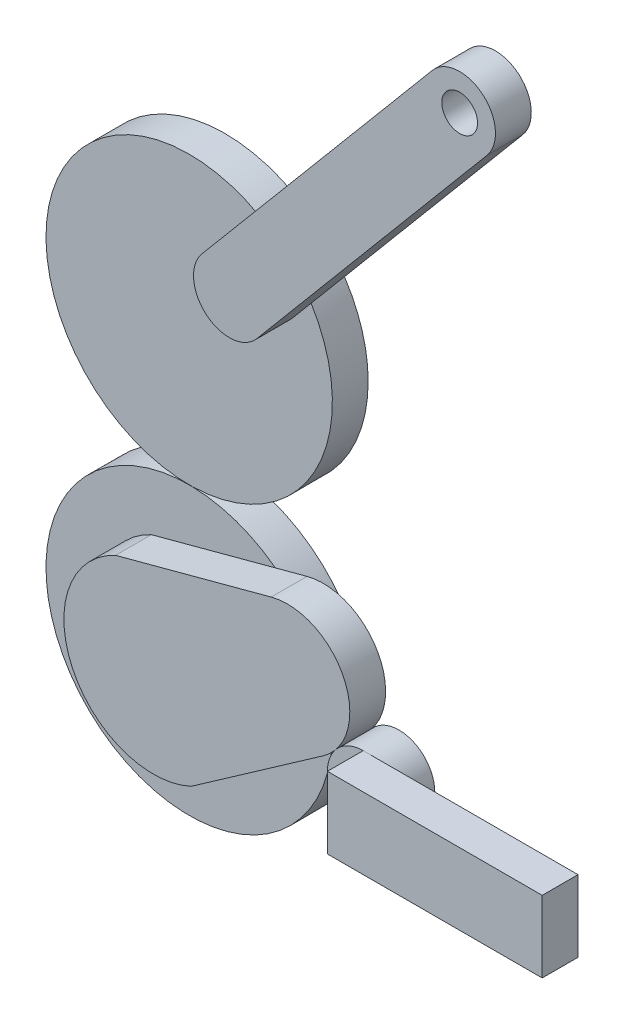
ISO-10303-21;
HEADER;
FILE_DESCRIPTION(('STEP AP214'),'2;1');
FILE_NAME('part.step','',(''),(''),'','','');
FILE_SCHEMA(('AUTOMOTIVE_DESIGN { 1 0 10303 214 1 1 1 1 }'));
ENDSEC;
DATA;
#1=APPLICATION_CONTEXT('core data for automotive mechanical design processes');
#2=APPLICATION_PROTOCOL_DEFINITION('international standard','automotive_design',2000,#1);
#3=PRODUCT_CONTEXT('',#1,'mechanical');
#4=PRODUCT('Part','Part','',(#3));
#5=PRODUCT_RELATED_PRODUCT_CATEGORY('part','',(#4));
#6=PRODUCT_DEFINITION_FORMATION('','',#4);
#7=PRODUCT_DEFINITION_CONTEXT('part definition',#1,'design');
#8=PRODUCT_DEFINITION('design','',#6,#7);
#9=PRODUCT_DEFINITION_SHAPE('','',#8);
#10=(LENGTH_UNIT() NAMED_UNIT(*) SI_UNIT(.MILLI.,.METRE.));
#11=(NAMED_UNIT(*) PLANE_ANGLE_UNIT() SI_UNIT($,.RADIAN.));
#12=(NAMED_UNIT(*) SI_UNIT($,.STERADIAN.) SOLID_ANGLE_UNIT());
#13=UNCERTAINTY_MEASURE_WITH_UNIT(LENGTH_MEASURE(1.E-05),#10,'distance_accuracy_value','');
#14=(GEOMETRIC_REPRESENTATION_CONTEXT(3) GLOBAL_UNCERTAINTY_ASSIGNED_CONTEXT((#13)) GLOBAL_UNIT_ASSIGNED_CONTEXT((#10,
#11,#12)) REPRESENTATION_CONTEXT('',''));
#15=CARTESIAN_POINT('',(0.,0.,0.));
#16=DIRECTION('',(0.,0.,1.));
#17=DIRECTION('',(1.,0.,0.));
#18=AXIS2_PLACEMENT_3D('',#15,#16,#17);
#19=CARTESIAN_POINT('',(58.6101560783245,-80.,20.));
#20=DIRECTION('',(0.,0.,-1.));
#21=DIRECTION('',(-1.,0.,0.));
#22=AXIS2_PLACEMENT_3D('',#19,#20,#21);
#23=CYLINDRICAL_SURFACE('',#22,10.);
#24=CARTESIAN_POINT('',(58.6101560783245,-80.,20.));
#25=DIRECTION('',(0.,0.,1.));
#26=DIRECTION('',(1.,0.,0.));
#27=AXIS2_PLACEMENT_3D('',#24,#25,#26);
#28=CIRCLE('',#27,10.);
#29=CARTESIAN_POINT('',(58.6101560783245,-70.,20.));
#30=VERTEX_POINT('',#29);
#31=CARTESIAN_POINT('',(58.6101560783245,-90.,20.));
#32=VERTEX_POINT('',#31);
#33=EDGE_CURVE('E12',#30,#32,#28,.T.);
#34=ORIENTED_EDGE('',*,*,#33,.F.);
#35=EDGE_CURVE('E58',#32,#30,#28,.T.);
#36=ORIENTED_EDGE('',*,*,#35,.F.);
#37=EDGE_LOOP('',(#34,#36));
#38=FACE_BOUND('',#37,.T.);
#39=CARTESIAN_POINT('',(58.6101560783245,-80.,10.));
#40=DIRECTION('',(0.,0.,1.));
#41=DIRECTION('',(1.,0.,0.));
#42=AXIS2_PLACEMENT_3D('',#39,#40,#41);
#43=CIRCLE('',#42,10.);
#44=CARTESIAN_POINT('',(68.6101560783245,-80.,10.));
#45=VERTEX_POINT('',#44);
#46=EDGE_CURVE('E53',#45,#45,#43,.T.);
#47=ORIENTED_EDGE('',*,*,#46,.T.);
#48=EDGE_LOOP('',(#47));
#49=FACE_BOUND('',#48,.T.);
#50=ADVANCED_FACE('F50',(#38,#49),#23,.T.);
#51=CARTESIAN_POINT('',(58.6101560783245,-80.,20.));
#52=DIRECTION('',(0.,0.,1.));
#53=DIRECTION('',(1.,0.,0.));
#54=AXIS2_PLACEMENT_3D('',#51,#52,#53);
#55=PLANE('',#54);
#56=DIRECTION('',(0.,-1.,0.));
#57=VECTOR('',#56,1.);
#58=CARTESIAN_POINT('',(58.6101560783245,-70.,20.));
#59=LINE('',#58,#57);
#60=EDGE_CURVE('E63',#30,#32,#59,.T.);
#61=ORIENTED_EDGE('',*,*,#60,.F.);
#62=ORIENTED_EDGE('',*,*,#33,.T.);
#63=EDGE_LOOP('',(#61,#62));
#64=FACE_BOUND('',#63,.T.);
#65=ADVANCED_FACE('F137',(#64),#55,.T.);
#66=CARTESIAN_POINT('',(58.6101560783245,-80.,10.));
#67=DIRECTION('',(0.,0.,1.));
#68=DIRECTION('',(1.,0.,0.));
#69=AXIS2_PLACEMENT_3D('',#66,#67,#68);
#70=PLANE('',#69);
#71=ORIENTED_EDGE('',*,*,#46,.F.);
#72=EDGE_LOOP('',(#71));
#73=FACE_BOUND('',#72,.T.);
#74=ADVANCED_FACE('F139',(#73),#70,.F.);
#75=CARTESIAN_POINT('',(0.,0.,20.));
#76=DIRECTION('',(0.,0.,1.));
#77=DIRECTION('',(1.,0.,0.));
#78=AXIS2_PLACEMENT_3D('',#75,#76,#77);
#79=PLANE('',#78);
#80=DIRECTION('',(1.,0.,0.));
#81=VECTOR('',#80,1.);
#82=CARTESIAN_POINT('',(58.6101560783245,-90.,20.));
#83=LINE('',#82,#81);
#84=CARTESIAN_POINT('',(118.610156078325,-90.,20.));
#85=VERTEX_POINT('',#84);
#86=EDGE_CURVE('E123',#32,#85,#83,.T.);
#87=ORIENTED_EDGE('',*,*,#86,.F.);
#88=ORIENTED_EDGE('',*,*,#35,.T.);
#89=DIRECTION('',(-1.,0.,0.));
#90=VECTOR('',#89,1.);
#91=CARTESIAN_POINT('',(118.610156078325,-70.,20.));
#92=LINE('',#91,#90);
#93=CARTESIAN_POINT('',(118.610156078325,-70.,20.));
#94=VERTEX_POINT('',#93);
#95=EDGE_CURVE('E119',#94,#30,#92,.T.);
#96=ORIENTED_EDGE('',*,*,#95,.F.);
#97=DIRECTION('',(0.,1.,0.));
#98=VECTOR('',#97,1.);
#99=CARTESIAN_POINT('',(118.610156078325,-90.,20.));
#100=LINE('',#99,#98);
#101=EDGE_CURVE('E88',#85,#94,#100,.T.);
#102=ORIENTED_EDGE('',*,*,#101,.F.);
#103=EDGE_LOOP('',(#87,#88,#96,#102));
#104=FACE_BOUND('',#103,.T.);
#105=ADVANCED_FACE('F135',(#104),#79,.F.);
#106=CARTESIAN_POINT('',(118.610156078325,-70.,30.));
#107=DIRECTION('',(0.,-1.,0.));
#108=DIRECTION('',(1.,0.,0.));
#109=AXIS2_PLACEMENT_3D('',#106,#107,#108);
#110=PLANE('',#109);
#111=ORIENTED_EDGE('',*,*,#95,.T.);
#112=DIRECTION('',(0.,0.,-1.));
#113=VECTOR('',#112,1.);
#114=CARTESIAN_POINT('',(58.6101560783245,-70.,30.));
#115=LINE('',#114,#113);
#116=CARTESIAN_POINT('',(58.6101560783245,-70.,30.));
#117=VERTEX_POINT('',#116);
#118=EDGE_CURVE('E110',#117,#30,#115,.T.);
#119=ORIENTED_EDGE('',*,*,#118,.F.);
#120=DIRECTION('',(-1.,0.,0.));
#121=VECTOR('',#120,1.);
#122=CARTESIAN_POINT('',(118.610156078325,-70.,30.));
#123=LINE('',#122,#121);
#124=CARTESIAN_POINT('',(118.610156078325,-70.,30.));
#125=VERTEX_POINT('',#124);
#126=EDGE_CURVE('E102',#125,#117,#123,.T.);
#127=ORIENTED_EDGE('',*,*,#126,.F.);
#128=DIRECTION('',(0.,0.,-1.));
#129=VECTOR('',#128,1.);
#130=CARTESIAN_POINT('',(118.610156078325,-70.,30.));
#131=LINE('',#130,#129);
#132=EDGE_CURVE('E115',#125,#94,#131,.T.);
#133=ORIENTED_EDGE('',*,*,#132,.T.);
#134=EDGE_LOOP('',(#111,#119,#127,#133));
#135=FACE_BOUND('',#134,.T.);
#136=ADVANCED_FACE('F147',(#135),#110,.F.);
#137=CARTESIAN_POINT('',(58.6101560783245,-70.,30.));
#138=DIRECTION('',(1.,0.,0.));
#139=DIRECTION('',(0.,0.,-1.));
#140=AXIS2_PLACEMENT_3D('',#137,#138,#139);
#141=PLANE('',#140);
#142=ORIENTED_EDGE('',*,*,#60,.T.);
#143=DIRECTION('',(0.,0.,-1.));
#144=VECTOR('',#143,1.);
#145=CARTESIAN_POINT('',(58.6101560783245,-90.,30.));
#146=LINE('',#145,#144);
#147=CARTESIAN_POINT('',(58.6101560783245,-90.,30.));
#148=VERTEX_POINT('',#147);
#149=EDGE_CURVE('E106',#148,#32,#146,.T.);
#150=ORIENTED_EDGE('',*,*,#149,.F.);
#151=DIRECTION('',(0.,-1.,0.));
#152=VECTOR('',#151,1.);
#153=CARTESIAN_POINT('',(58.6101560783245,-70.,30.));
#154=LINE('',#153,#152);
#155=EDGE_CURVE('E96',#117,#148,#154,.T.);
#156=ORIENTED_EDGE('',*,*,#155,.F.);
#157=ORIENTED_EDGE('',*,*,#118,.T.);
#158=EDGE_LOOP('',(#142,#150,#156,#157));
#159=FACE_BOUND('',#158,.T.);
#160=ADVANCED_FACE('F107',(#159),#141,.F.);
#161=CARTESIAN_POINT('',(58.6101560783245,-90.,30.));
#162=DIRECTION('',(0.,1.,0.));
#163=DIRECTION('',(0.,0.,1.));
#164=AXIS2_PLACEMENT_3D('',#161,#162,#163);
#165=PLANE('',#164);
#166=ORIENTED_EDGE('',*,*,#86,.T.);
#167=DIRECTION('',(0.,0.,-1.));
#168=VECTOR('',#167,1.);
#169=CARTESIAN_POINT('',(118.610156078325,-90.,30.));
#170=LINE('',#169,#168);
#171=CARTESIAN_POINT('',(118.610156078325,-90.,30.));
#172=VERTEX_POINT('',#171);
#173=EDGE_CURVE('E111',#172,#85,#170,.T.);
#174=ORIENTED_EDGE('',*,*,#173,.F.);
#175=DIRECTION('',(1.,0.,0.));
#176=VECTOR('',#175,1.);
#177=CARTESIAN_POINT('',(58.6101560783245,-90.,30.));
#178=LINE('',#177,#176);
#179=EDGE_CURVE('E99',#148,#172,#178,.T.);
#180=ORIENTED_EDGE('',*,*,#179,.F.);
#181=ORIENTED_EDGE('',*,*,#149,.T.);
#182=EDGE_LOOP('',(#166,#174,#180,#181));
#183=FACE_BOUND('',#182,.T.);
#184=ADVANCED_FACE('F113',(#183),#165,.F.);
#185=CARTESIAN_POINT('',(118.610156078325,-90.,30.));
#186=DIRECTION('',(-1.,0.,0.));
#187=DIRECTION('',(0.,0.,1.));
#188=AXIS2_PLACEMENT_3D('',#185,#186,#187);
#189=PLANE('',#188);
#190=ORIENTED_EDGE('',*,*,#101,.T.);
#191=ORIENTED_EDGE('',*,*,#132,.F.);
#192=DIRECTION('',(0.,1.,0.));
#193=VECTOR('',#192,1.);
#194=CARTESIAN_POINT('',(118.610156078325,-90.,30.));
#195=LINE('',#194,#193);
#196=EDGE_CURVE('E72',#172,#125,#195,.T.);
#197=ORIENTED_EDGE('',*,*,#196,.F.);
#198=ORIENTED_EDGE('',*,*,#173,.T.);
#199=EDGE_LOOP('',(#190,#191,#197,#198));
#200=FACE_BOUND('',#199,.T.);
#201=ADVANCED_FACE('F155',(#200),#189,.F.);
#202=CARTESIAN_POINT('',(0.,0.,30.));
#203=DIRECTION('',(0.,0.,1.));
#204=DIRECTION('',(1.,0.,0.));
#205=AXIS2_PLACEMENT_3D('',#202,#203,#204);
#206=PLANE('',#205);
#207=ORIENTED_EDGE('',*,*,#126,.T.);
#208=ORIENTED_EDGE('',*,*,#155,.T.);
#209=ORIENTED_EDGE('',*,*,#179,.T.);
#210=ORIENTED_EDGE('',*,*,#196,.T.);
#211=EDGE_LOOP('',(#207,#208,#209,#210));
#212=FACE_BOUND('',#211,.T.);
#213=ADVANCED_FACE('F97',(#212),#206,.T.);
#214=CLOSED_SHELL('',(#50,#65,#74,#105,#136,#160,#184,#201,#213));
#215=MANIFOLD_SOLID_BREP('B2',#214);
#216=CARTESIAN_POINT('',(0.,-80.,10.));
#217=DIRECTION('',(0.,0.,-1.));
#218=DIRECTION('',(-1.,0.,0.));
#219=AXIS2_PLACEMENT_3D('',#216,#217,#218);
#220=CYLINDRICAL_SURFACE('',#219,40.);
#221=CARTESIAN_POINT('',(0.,-80.,10.));
#222=DIRECTION('',(0.,0.,1.));
#223=DIRECTION('',(1.,0.,0.));
#224=AXIS2_PLACEMENT_3D('',#221,#222,#223);
#225=CIRCLE('',#224,40.);
#226=CARTESIAN_POINT('',(24.0789496189808,-48.0593646705864,10.));
#227=VERTEX_POINT('',#226);
#228=CARTESIAN_POINT('',(39.9455966731343,-82.0854990835007,10.));
#229=VERTEX_POINT('',#228);
#230=EDGE_CURVE('E234',#227,#229,#225,.T.);
#231=ORIENTED_EDGE('',*,*,#230,.F.);
#232=EDGE_CURVE('E300',#229,#227,#225,.T.);
#233=ORIENTED_EDGE('',*,*,#232,.F.);
#234=EDGE_LOOP('',(#231,#233));
#235=FACE_BOUND('',#234,.T.);
#236=CARTESIAN_POINT('',(0.,-80.,0.));
#237=DIRECTION('',(0.,0.,1.));
#238=DIRECTION('',(1.,0.,0.));
#239=AXIS2_PLACEMENT_3D('',#236,#237,#238);
#240=CIRCLE('',#239,40.);
#241=CARTESIAN_POINT('',(40.,-80.,0.));
#242=VERTEX_POINT('',#241);
#243=EDGE_CURVE('E228',#242,#242,#240,.T.);
#244=ORIENTED_EDGE('',*,*,#243,.T.);
#245=EDGE_LOOP('',(#244));
#246=FACE_BOUND('',#245,.T.);
#247=ADVANCED_FACE('F225',(#235,#246),#220,.T.);
#248=CARTESIAN_POINT('',(0.,-80.,10.));
#249=DIRECTION('',(0.,0.,1.));
#250=DIRECTION('',(1.,0.,0.));
#251=AXIS2_PLACEMENT_3D('',#248,#249,#250);
#252=PLANE('',#251);
#253=DIRECTION('',(-0.965925826289067,-0.258819045102525,0.));
#254=VECTOR('',#253,1.);
#255=CARTESIAN_POINT('',(-10.5654565435175,-57.3423053240838,10.));
#256=LINE('',#255,#254);
#257=CARTESIAN_POINT('',(-10.5654565435175,-57.3423053240838,10.));
#258=VERTEX_POINT('',#257);
#259=EDGE_CURVE('E48',#227,#258,#256,.T.);
#260=ORIENTED_EDGE('',*,*,#259,.F.);
#261=ORIENTED_EDGE('',*,*,#230,.T.);
#262=DIRECTION('',(0.819152044288988,0.573576436351051,0.));
#263=VECTOR('',#262,1.);
#264=CARTESIAN_POINT('',(10.5654565435175,-102.657694675916,10.));
#265=LINE('',#264,#263);
#266=CARTESIAN_POINT('',(10.5654565435175,-102.657694675916,10.));
#267=VERTEX_POINT('',#266);
#268=EDGE_CURVE('E247',#267,#229,#265,.T.);
#269=ORIENTED_EDGE('',*,*,#268,.F.);
#270=CARTESIAN_POINT('',(0.,-80.,10.));
#271=DIRECTION('',(0.,0.,1.));
#272=DIRECTION('',(-1.,0.,0.));
#273=AXIS2_PLACEMENT_3D('',#270,#271,#272);
#274=CIRCLE('',#273,25.);
#275=EDGE_CURVE('E243',#258,#267,#274,.T.);
#276=ORIENTED_EDGE('',*,*,#275,.F.);
#277=EDGE_LOOP('',(#260,#261,#269,#276));
#278=FACE_BOUND('',#277,.T.);
#279=ADVANCED_FACE('F349',(#278),#252,.T.);
#280=CARTESIAN_POINT('',(0.,-80.,0.));
#281=DIRECTION('',(0.,0.,1.));
#282=DIRECTION('',(1.,0.,0.));
#283=AXIS2_PLACEMENT_3D('',#280,#281,#282);
#284=PLANE('',#283);
#285=ORIENTED_EDGE('',*,*,#243,.F.);
#286=EDGE_LOOP('',(#285));
#287=FACE_BOUND('',#286,.T.);
#288=ADVANCED_FACE('F353',(#287),#284,.F.);
#289=CARTESIAN_POINT('',(0.,-80.,20.));
#290=DIRECTION('',(0.,0.,-1.));
#291=DIRECTION('',(-1.,0.,0.));
#292=AXIS2_PLACEMENT_3D('',#289,#290,#291);
#293=CYLINDRICAL_SURFACE('',#292,25.);
#294=ORIENTED_EDGE('',*,*,#275,.T.);
#295=DIRECTION('',(0.,0.,-1.));
#296=VECTOR('',#295,1.);
#297=CARTESIAN_POINT('',(10.5654565435175,-102.657694675916,20.));
#298=LINE('',#297,#296);
#299=CARTESIAN_POINT('',(10.5654565435175,-102.657694675916,20.));
#300=VERTEX_POINT('',#299);
#301=EDGE_CURVE('E276',#300,#267,#298,.T.);
#302=ORIENTED_EDGE('',*,*,#301,.F.);
#303=CARTESIAN_POINT('',(0.,-80.,20.));
#304=DIRECTION('',(0.,0.,1.));
#305=DIRECTION('',(-1.,0.,0.));
#306=AXIS2_PLACEMENT_3D('',#303,#304,#305);
#307=CIRCLE('',#306,25.);
#308=CARTESIAN_POINT('',(-10.5654565435175,-57.3423053240838,20.));
#309=VERTEX_POINT('',#308);
#310=EDGE_CURVE('E283',#309,#300,#307,.T.);
#311=ORIENTED_EDGE('',*,*,#310,.F.);
#312=DIRECTION('',(0.,0.,-1.));
#313=VECTOR('',#312,1.);
#314=CARTESIAN_POINT('',(-10.5654565435175,-57.3423053240838,20.));
#315=LINE('',#314,#313);
#316=EDGE_CURVE('E327',#309,#258,#315,.T.);
#317=ORIENTED_EDGE('',*,*,#316,.T.);
#318=EDGE_LOOP('',(#294,#302,#311,#317));
#319=FACE_BOUND('',#318,.T.);
#320=ADVANCED_FACE('F294',(#319),#293,.T.);
#321=CARTESIAN_POINT('',(10.5654565435175,-102.657694675916,20.));
#322=DIRECTION('',(-0.573576436351051,0.819152044288988,0.));
#323=DIRECTION('',(-0.819152044288988,-0.573576436351051,0.));
#324=AXIS2_PLACEMENT_3D('',#321,#322,#323);
#325=PLANE('',#324);
#326=ORIENTED_EDGE('',*,*,#268,.T.);
#327=CARTESIAN_POINT('',(47.427298536522,-76.8467550401189,10.));
#328=VERTEX_POINT('',#327);
#329=EDGE_CURVE('E315',#229,#328,#265,.T.);
#330=ORIENTED_EDGE('',*,*,#329,.T.);
#331=DIRECTION('',(0.,0.,-1.));
#332=VECTOR('',#331,1.);
#333=CARTESIAN_POINT('',(47.427298536522,-76.8467550401189,20.));
#334=LINE('',#333,#332);
#335=CARTESIAN_POINT('',(47.427298536522,-76.8467550401189,20.));
#336=VERTEX_POINT('',#335);
#337=EDGE_CURVE('E278',#336,#328,#334,.T.);
#338=ORIENTED_EDGE('',*,*,#337,.F.);
#339=DIRECTION('',(0.819152044288988,0.573576436351051,0.));
#340=VECTOR('',#339,1.);
#341=CARTESIAN_POINT('',(10.5654565435175,-102.657694675916,20.));
#342=LINE('',#341,#340);
#343=EDGE_CURVE('E272',#300,#336,#342,.T.);
#344=ORIENTED_EDGE('',*,*,#343,.F.);
#345=ORIENTED_EDGE('',*,*,#301,.T.);
#346=EDGE_LOOP('',(#326,#330,#338,#344,#345));
#347=FACE_BOUND('',#346,.T.);
#348=ADVANCED_FACE('F274',(#347),#325,.F.);
#349=CARTESIAN_POINT('',(37.4178441562144,-62.5517727183067,20.));
#350=DIRECTION('',(0.,0.,-1.));
#351=DIRECTION('',(-1.,0.,0.));
#352=AXIS2_PLACEMENT_3D('',#349,#350,#351);
#353=CYLINDRICAL_SURFACE('',#352,17.4509511652627);
#354=DIRECTION('',(0.,0.,-1.));
#355=VECTOR('',#354,1.);
#356=CARTESIAN_POINT('',(32.9012056394903,-45.6954482944702,20.));
#357=LINE('',#356,#355);
#358=CARTESIAN_POINT('',(32.9012056394903,-45.6954482944702,20.));
#359=VERTEX_POINT('',#358);
#360=CARTESIAN_POINT('',(32.9012056394903,-45.6954482944702,10.));
#361=VERTEX_POINT('',#360);
#362=EDGE_CURVE('E301',#359,#361,#357,.T.);
#363=ORIENTED_EDGE('',*,*,#362,.F.);
#364=CARTESIAN_POINT('',(37.4178441562144,-62.5517727183067,20.));
#365=DIRECTION('',(0.,0.,1.));
#366=DIRECTION('',(1.,0.,0.));
#367=AXIS2_PLACEMENT_3D('',#364,#365,#366);
#368=CIRCLE('',#367,17.4509511652627);
#369=EDGE_CURVE('E282',#336,#359,#368,.T.);
#370=ORIENTED_EDGE('',*,*,#369,.F.);
#371=ORIENTED_EDGE('',*,*,#337,.T.);
#372=CARTESIAN_POINT('',(37.4178441562144,-62.5517727183067,10.));
#373=DIRECTION('',(0.,0.,1.));
#374=DIRECTION('',(1.,0.,0.));
#375=AXIS2_PLACEMENT_3D('',#372,#373,#374);
#376=CIRCLE('',#375,17.4509511652627);
#377=EDGE_CURVE('E322',#328,#361,#376,.T.);
#378=ORIENTED_EDGE('',*,*,#377,.T.);
#379=EDGE_LOOP('',(#363,#370,#371,#378));
#380=FACE_BOUND('',#379,.T.);
#381=ADVANCED_FACE('F339',(#380),#353,.T.);
#382=CARTESIAN_POINT('',(-10.5654565435175,-57.3423053240838,20.));
#383=DIRECTION('',(0.258819045102525,-0.965925826289067,0.));
#384=DIRECTION('',(0.965925826289067,0.258819045102525,0.));
#385=AXIS2_PLACEMENT_3D('',#382,#383,#384);
#386=PLANE('',#385);
#387=EDGE_CURVE('E236',#361,#227,#256,.T.);
#388=ORIENTED_EDGE('',*,*,#387,.T.);
#389=ORIENTED_EDGE('',*,*,#259,.T.);
#390=ORIENTED_EDGE('',*,*,#316,.F.);
#391=DIRECTION('',(-0.965925826289067,-0.258819045102525,0.));
#392=VECTOR('',#391,1.);
#393=CARTESIAN_POINT('',(-10.5654565435175,-57.3423053240838,20.));
#394=LINE('',#393,#392);
#395=EDGE_CURVE('E288',#359,#309,#394,.T.);
#396=ORIENTED_EDGE('',*,*,#395,.F.);
#397=ORIENTED_EDGE('',*,*,#362,.T.);
#398=EDGE_LOOP('',(#388,#389,#390,#396,#397));
#399=FACE_BOUND('',#398,.T.);
#400=ADVANCED_FACE('F319',(#399),#386,.F.);
#401=CARTESIAN_POINT('',(0.,-80.,20.));
#402=DIRECTION('',(0.,0.,-1.));
#403=DIRECTION('',(-1.,0.,0.));
#404=AXIS2_PLACEMENT_3D('',#401,#402,#403);
#405=PLANE('',#404);
#406=ORIENTED_EDGE('',*,*,#310,.T.);
#407=ORIENTED_EDGE('',*,*,#343,.T.);
#408=ORIENTED_EDGE('',*,*,#369,.T.);
#409=ORIENTED_EDGE('',*,*,#395,.T.);
#410=EDGE_LOOP('',(#406,#407,#408,#409));
#411=FACE_BOUND('',#410,.T.);
#412=ADVANCED_FACE('F286',(#411),#405,.F.);
#413=CARTESIAN_POINT('',(0.,-80.,10.));
#414=DIRECTION('',(0.,0.,-1.));
#415=DIRECTION('',(-1.,0.,0.));
#416=AXIS2_PLACEMENT_3D('',#413,#414,#415);
#417=PLANE('',#416);
#418=ORIENTED_EDGE('',*,*,#329,.F.);
#419=ORIENTED_EDGE('',*,*,#232,.T.);
#420=ORIENTED_EDGE('',*,*,#387,.F.);
#421=ORIENTED_EDGE('',*,*,#377,.F.);
#422=EDGE_LOOP('',(#418,#419,#420,#421));
#423=FACE_BOUND('',#422,.T.);
#424=ADVANCED_FACE('F313',(#423),#417,.T.);
#425=CLOSED_SHELL('',(#247,#279,#288,#320,#348,#381,#400,#412,#424));
#426=MANIFOLD_SOLID_BREP('B6',#425);
#427=CARTESIAN_POINT('',(0.,0.,10.));
#428=DIRECTION('',(0.,0.,-1.));
#429=DIRECTION('',(-1.,0.,0.));
#430=AXIS2_PLACEMENT_3D('',#427,#428,#429);
#431=CYLINDRICAL_SURFACE('',#430,40.);
#432=CARTESIAN_POINT('',(0.,0.,0.));
#433=DIRECTION('',(0.,0.,1.));
#434=DIRECTION('',(1.,0.,0.));
#435=AXIS2_PLACEMENT_3D('',#432,#433,#434);
#436=CIRCLE('',#435,40.);
#437=CARTESIAN_POINT('',(40.,0.,0.));
#438=VERTEX_POINT('',#437);
#439=EDGE_CURVE('E415',#438,#438,#436,.T.);
#440=ORIENTED_EDGE('',*,*,#439,.T.);
#441=EDGE_LOOP('',(#440));
#442=FACE_BOUND('',#441,.T.);
#443=CARTESIAN_POINT('',(0.,0.,10.));
#444=DIRECTION('',(0.,0.,1.));
#445=DIRECTION('',(1.,0.,0.));
#446=AXIS2_PLACEMENT_3D('',#443,#444,#445);
#447=CIRCLE('',#446,40.);
#448=CARTESIAN_POINT('',(34.0666120173045,20.9634430774729,10.));
#449=VERTEX_POINT('',#448);
#450=CARTESIAN_POINT('',(19.6190330617486,34.8581918883068,10.));
#451=VERTEX_POINT('',#450);
#452=EDGE_CURVE('E420',#449,#451,#447,.T.);
#453=ORIENTED_EDGE('',*,*,#452,.F.);
#454=EDGE_CURVE('E491',#451,#449,#447,.T.);
#455=ORIENTED_EDGE('',*,*,#454,.F.);
#456=EDGE_LOOP('',(#453,#455));
#457=FACE_BOUND('',#456,.T.);
#458=ADVANCED_FACE('F412',(#442,#457),#431,.T.);
#459=CARTESIAN_POINT('',(0.,0.,10.));
#460=DIRECTION('',(0.,0.,1.));
#461=DIRECTION('',(1.,0.,0.));
#462=AXIS2_PLACEMENT_3D('',#459,#460,#461);
#463=PLANE('',#462);
#464=DIRECTION('',(-0.643434856602738,-0.765500872180178,0.));
#465=VECTOR('',#464,1.);
#466=CARTESIAN_POINT('',(13.5581947137946,27.6475520016238,10.));
#467=LINE('',#466,#465);
#468=CARTESIAN_POINT('',(13.5581947137946,27.6475520016238,10.));
#469=VERTEX_POINT('',#468);
#470=EDGE_CURVE('E223',#451,#469,#467,.T.);
#471=ORIENTED_EDGE('',*,*,#470,.F.);
#472=ORIENTED_EDGE('',*,*,#454,.T.);
#473=DIRECTION('',(0.643434856602739,0.765500872180178,0.));
#474=VECTOR('',#473,1.);
#475=CARTESIAN_POINT('',(28.8682121573982,14.7788548695691,10.));
#476=LINE('',#475,#474);
#477=CARTESIAN_POINT('',(28.8682121573982,14.7788548695691,10.));
#478=VERTEX_POINT('',#477);
#479=EDGE_CURVE('E433',#478,#449,#476,.T.);
#480=ORIENTED_EDGE('',*,*,#479,.F.);
#481=CARTESIAN_POINT('',(21.2132034355964,21.2132034355965,10.));
#482=DIRECTION('',(0.,0.,1.));
#483=DIRECTION('',(1.,0.,0.));
#484=AXIS2_PLACEMENT_3D('',#481,#482,#483);
#485=CIRCLE('',#484,10.);
#486=EDGE_CURVE('E429',#469,#478,#485,.T.);
#487=ORIENTED_EDGE('',*,*,#486,.F.);
#488=EDGE_LOOP('',(#471,#472,#480,#487));
#489=FACE_BOUND('',#488,.T.);
#490=ADVANCED_FACE('F505',(#489),#463,.T.);
#491=CARTESIAN_POINT('',(0.,0.,0.));
#492=DIRECTION('',(0.,0.,1.));
#493=DIRECTION('',(1.,0.,0.));
#494=AXIS2_PLACEMENT_3D('',#491,#492,#493);
#495=PLANE('',#494);
#496=CARTESIAN_POINT('',(21.2132034355964,21.2132034355965,0.));
#497=DIRECTION('',(0.,0.,1.));
#498=DIRECTION('',(1.,0.,0.));
#499=AXIS2_PLACEMENT_3D('',#496,#497,#498);
#500=CIRCLE('',#499,5.);
#501=CARTESIAN_POINT('',(26.2132034355964,21.2132034355965,0.));
#502=VERTEX_POINT('',#501);
#503=EDGE_CURVE('E483',#502,#502,#500,.T.);
#504=ORIENTED_EDGE('',*,*,#503,.T.);
#505=EDGE_LOOP('',(#504));
#506=FACE_BOUND('',#505,.T.);
#507=ORIENTED_EDGE('',*,*,#439,.F.);
#508=EDGE_LOOP('',(#507));
#509=FACE_BOUND('',#508,.T.);
#510=ADVANCED_FACE('F502',(#506,#509),#495,.F.);
#511=CARTESIAN_POINT('',(21.2132034355964,21.2132034355965,0.));
#512=DIRECTION('',(0.,0.,1.));
#513=DIRECTION('',(1.,0.,0.));
#514=AXIS2_PLACEMENT_3D('',#511,#512,#513);
#515=CYLINDRICAL_SURFACE('',#514,5.);
#516=ORIENTED_EDGE('',*,*,#503,.F.);
#517=EDGE_LOOP('',(#516));
#518=FACE_BOUND('',#517,.T.);
#519=CARTESIAN_POINT('',(21.2132034355964,21.2132034355965,10.));
#520=DIRECTION('',(0.,0.,1.));
#521=DIRECTION('',(1.,0.,0.));
#522=AXIS2_PLACEMENT_3D('',#519,#520,#521);
#523=CIRCLE('',#522,5.);
#524=CARTESIAN_POINT('',(26.2132034355964,21.2132034355965,10.));
#525=VERTEX_POINT('',#524);
#526=EDGE_CURVE('E480',#525,#525,#523,.T.);
#527=ORIENTED_EDGE('',*,*,#526,.T.);
#528=EDGE_LOOP('',(#527));
#529=FACE_BOUND('',#528,.T.);
#530=ADVANCED_FACE('F504',(#518,#529),#515,.F.);
#531=CARTESIAN_POINT('',(21.2132034355964,21.2132034355965,20.));
#532=DIRECTION('',(0.,0.,1.));
#533=DIRECTION('',(1.,0.,0.));
#534=AXIS2_PLACEMENT_3D('',#531,#532,#533);
#535=PLANE('',#534);
#536=CARTESIAN_POINT('',(85.5566890958702,97.7632906536143,20.));
#537=DIRECTION('',(0.,0.,1.));
#538=DIRECTION('',(1.,0.,0.));
#539=AXIS2_PLACEMENT_3D('',#536,#537,#538);
#540=CIRCLE('',#539,5.00000000000001);
#541=CARTESIAN_POINT('',(90.5566890958702,97.7632906536143,20.));
#542=VERTEX_POINT('',#541);
#543=EDGE_CURVE('E608',#542,#542,#540,.T.);
#544=ORIENTED_EDGE('',*,*,#543,.F.);
#545=EDGE_LOOP('',(#544));
#546=FACE_BOUND('',#545,.T.);
#547=CARTESIAN_POINT('',(21.2132034355964,21.2132034355965,20.));
#548=DIRECTION('',(0.,0.,1.));
#549=DIRECTION('',(1.,0.,0.));
#550=AXIS2_PLACEMENT_3D('',#547,#548,#549);
#551=CIRCLE('',#550,10.);
#552=CARTESIAN_POINT('',(13.5581947137946,27.6475520016238,20.));
#553=VERTEX_POINT('',#552);
#554=CARTESIAN_POINT('',(28.8682121573982,14.7788548695691,20.));
#555=VERTEX_POINT('',#554);
#556=EDGE_CURVE('E469',#553,#555,#551,.T.);
#557=ORIENTED_EDGE('',*,*,#556,.T.);
#558=DIRECTION('',(0.643434856602739,0.765500872180178,0.));
#559=VECTOR('',#558,1.);
#560=CARTESIAN_POINT('',(28.8682121573982,14.7788548695691,20.));
#561=LINE('',#560,#559);
#562=CARTESIAN_POINT('',(93.211697817672,91.3289420875869,20.));
#563=VERTEX_POINT('',#562);
#564=EDGE_CURVE('E459',#555,#563,#561,.T.);
#565=ORIENTED_EDGE('',*,*,#564,.T.);
#566=CARTESIAN_POINT('',(85.5566890958702,97.7632906536143,20.));
#567=DIRECTION('',(0.,0.,1.));
#568=DIRECTION('',(1.,0.,0.));
#569=AXIS2_PLACEMENT_3D('',#566,#567,#568);
#570=CIRCLE('',#569,10.);
#571=CARTESIAN_POINT('',(77.9016803740684,104.197639219642,20.));
#572=VERTEX_POINT('',#571);
#573=EDGE_CURVE('E468',#563,#572,#570,.T.);
#574=ORIENTED_EDGE('',*,*,#573,.T.);
#575=DIRECTION('',(-0.643434856602738,-0.765500872180178,0.));
#576=VECTOR('',#575,1.);
#577=CARTESIAN_POINT('',(13.5581947137946,27.6475520016238,20.));
#578=LINE('',#577,#576);
#579=EDGE_CURVE('E474',#572,#553,#578,.T.);
#580=ORIENTED_EDGE('',*,*,#579,.T.);
#581=EDGE_LOOP('',(#557,#565,#574,#580));
#582=FACE_BOUND('',#581,.T.);
#583=ADVANCED_FACE('F472',(#546,#582),#535,.T.);
#584=CARTESIAN_POINT('',(13.5581947137946,27.6475520016238,20.));
#585=DIRECTION('',(0.765500872180178,-0.643434856602738,0.));
#586=DIRECTION('',(0.643434856602738,0.765500872180178,0.));
#587=AXIS2_PLACEMENT_3D('',#584,#585,#586);
#588=PLANE('',#587);
#589=CARTESIAN_POINT('',(77.9016803740684,104.197639219642,10.));
#590=VERTEX_POINT('',#589);
#591=EDGE_CURVE('E422',#590,#451,#467,.T.);
#592=ORIENTED_EDGE('',*,*,#591,.T.);
#593=ORIENTED_EDGE('',*,*,#470,.T.);
#594=DIRECTION('',(0.,0.,-1.));
#595=VECTOR('',#594,1.);
#596=CARTESIAN_POINT('',(13.5581947137946,27.6475520016238,20.));
#597=LINE('',#596,#595);
#598=EDGE_CURVE('E614',#553,#469,#597,.T.);
#599=ORIENTED_EDGE('',*,*,#598,.F.);
#600=ORIENTED_EDGE('',*,*,#579,.F.);
#601=DIRECTION('',(0.,0.,-1.));
#602=VECTOR('',#601,1.);
#603=CARTESIAN_POINT('',(77.9016803740684,104.197639219642,20.));
#604=LINE('',#603,#602);
#605=EDGE_CURVE('E485',#572,#590,#604,.T.);
#606=ORIENTED_EDGE('',*,*,#605,.T.);
#607=EDGE_LOOP('',(#592,#593,#599,#600,#606));
#608=FACE_BOUND('',#607,.T.);
#609=ADVANCED_FACE('F528',(#608),#588,.F.);
#610=CARTESIAN_POINT('',(85.5566890958702,97.7632906536143,20.));
#611=DIRECTION('',(0.,0.,-1.));
#612=DIRECTION('',(-1.,0.,0.));
#613=AXIS2_PLACEMENT_3D('',#610,#611,#612);
#614=CYLINDRICAL_SURFACE('',#613,10.);
#615=CARTESIAN_POINT('',(85.5566890958702,97.7632906536143,10.));
#616=DIRECTION('',(0.,0.,1.));
#617=DIRECTION('',(1.,0.,0.));
#618=AXIS2_PLACEMENT_3D('',#615,#616,#617);
#619=CIRCLE('',#618,10.);
#620=CARTESIAN_POINT('',(93.211697817672,91.3289420875869,10.));
#621=VERTEX_POINT('',#620);
#622=EDGE_CURVE('E618',#621,#590,#619,.T.);
#623=ORIENTED_EDGE('',*,*,#622,.T.);
#624=ORIENTED_EDGE('',*,*,#605,.F.);
#625=ORIENTED_EDGE('',*,*,#573,.F.);
#626=DIRECTION('',(0.,0.,-1.));
#627=VECTOR('',#626,1.);
#628=CARTESIAN_POINT('',(93.211697817672,91.3289420875869,20.));
#629=LINE('',#628,#627);
#630=EDGE_CURVE('E465',#563,#621,#629,.T.);
#631=ORIENTED_EDGE('',*,*,#630,.T.);
#632=EDGE_LOOP('',(#623,#624,#625,#631));
#633=FACE_BOUND('',#632,.T.);
#634=ADVANCED_FACE('F533',(#633),#614,.T.);
#635=CARTESIAN_POINT('',(28.8682121573982,14.7788548695691,20.));
#636=DIRECTION('',(-0.765500872180178,0.643434856602739,0.));
#637=DIRECTION('',(-0.643434856602739,-0.765500872180178,0.));
#638=AXIS2_PLACEMENT_3D('',#635,#636,#637);
#639=PLANE('',#638);
#640=ORIENTED_EDGE('',*,*,#479,.T.);
#641=EDGE_CURVE('E616',#449,#621,#476,.T.);
#642=ORIENTED_EDGE('',*,*,#641,.T.);
#643=ORIENTED_EDGE('',*,*,#630,.F.);
#644=ORIENTED_EDGE('',*,*,#564,.F.);
#645=DIRECTION('',(0.,0.,-1.));
#646=VECTOR('',#645,1.);
#647=CARTESIAN_POINT('',(28.8682121573982,14.7788548695691,20.));
#648=LINE('',#647,#646);
#649=EDGE_CURVE('E463',#555,#478,#648,.T.);
#650=ORIENTED_EDGE('',*,*,#649,.T.);
#651=EDGE_LOOP('',(#640,#642,#643,#644,#650));
#652=FACE_BOUND('',#651,.T.);
#653=ADVANCED_FACE('F461',(#652),#639,.F.);
#654=CARTESIAN_POINT('',(21.2132034355964,21.2132034355965,20.));
#655=DIRECTION('',(0.,0.,-1.));
#656=DIRECTION('',(-1.,0.,0.));
#657=AXIS2_PLACEMENT_3D('',#654,#655,#656);
#658=CYLINDRICAL_SURFACE('',#657,10.);
#659=ORIENTED_EDGE('',*,*,#486,.T.);
#660=ORIENTED_EDGE('',*,*,#649,.F.);
#661=ORIENTED_EDGE('',*,*,#556,.F.);
#662=ORIENTED_EDGE('',*,*,#598,.T.);
#663=EDGE_LOOP('',(#659,#660,#661,#662));
#664=FACE_BOUND('',#663,.T.);
#665=ADVANCED_FACE('F479',(#664),#658,.T.);
#666=CARTESIAN_POINT('',(21.2132034355964,21.2132034355965,10.));
#667=DIRECTION('',(0.,0.,1.));
#668=DIRECTION('',(1.,0.,0.));
#669=AXIS2_PLACEMENT_3D('',#666,#667,#668);
#670=PLANE('',#669);
#671=CARTESIAN_POINT('',(85.5566890958702,97.7632906536143,10.));
#672=DIRECTION('',(0.,0.,1.));
#673=DIRECTION('',(1.,0.,0.));
#674=AXIS2_PLACEMENT_3D('',#671,#672,#673);
#675=CIRCLE('',#674,5.00000000000001);
#676=CARTESIAN_POINT('',(90.5566890958702,97.7632906536143,10.));
#677=VERTEX_POINT('',#676);
#678=EDGE_CURVE('E605',#677,#677,#675,.T.);
#679=ORIENTED_EDGE('',*,*,#678,.T.);
#680=EDGE_LOOP('',(#679));
#681=FACE_BOUND('',#680,.T.);
#682=ORIENTED_EDGE('',*,*,#641,.F.);
#683=ORIENTED_EDGE('',*,*,#452,.T.);
#684=ORIENTED_EDGE('',*,*,#591,.F.);
#685=ORIENTED_EDGE('',*,*,#622,.F.);
#686=EDGE_LOOP('',(#682,#683,#684,#685));
#687=FACE_BOUND('',#686,.T.);
#688=ADVANCED_FACE('F562',(#681,#687),#670,.F.);
#689=ORIENTED_EDGE('',*,*,#526,.F.);
#690=EDGE_LOOP('',(#689));
#691=FACE_BOUND('',#690,.T.);
#692=ADVANCED_FACE('F569',(#691),#670,.F.);
#693=CARTESIAN_POINT('',(85.5566890958702,97.7632906536143,10.));
#694=DIRECTION('',(0.,0.,1.));
#695=DIRECTION('',(1.,0.,0.));
#696=AXIS2_PLACEMENT_3D('',#693,#694,#695);
#697=CYLINDRICAL_SURFACE('',#696,5.00000000000001);
#698=ORIENTED_EDGE('',*,*,#678,.F.);
#699=EDGE_LOOP('',(#698));
#700=FACE_BOUND('',#699,.T.);
#701=ORIENTED_EDGE('',*,*,#543,.T.);
#702=EDGE_LOOP('',(#701));
#703=FACE_BOUND('',#702,.T.);
#704=ADVANCED_FACE('F574',(#700,#703),#697,.F.);
#705=CLOSED_SHELL('',(#458,#490,#510,#530,#583,#609,#634,#653,#665,#688,#692,#704));
#706=MANIFOLD_SOLID_BREP('B42',#705);
#707=ADVANCED_BREP_SHAPE_REPRESENTATION('',(#18,#215,#426,#706),#14);
#708=SHAPE_DEFINITION_REPRESENTATION(#9,#707);
ENDSEC;
END-ISO-10303-21;
